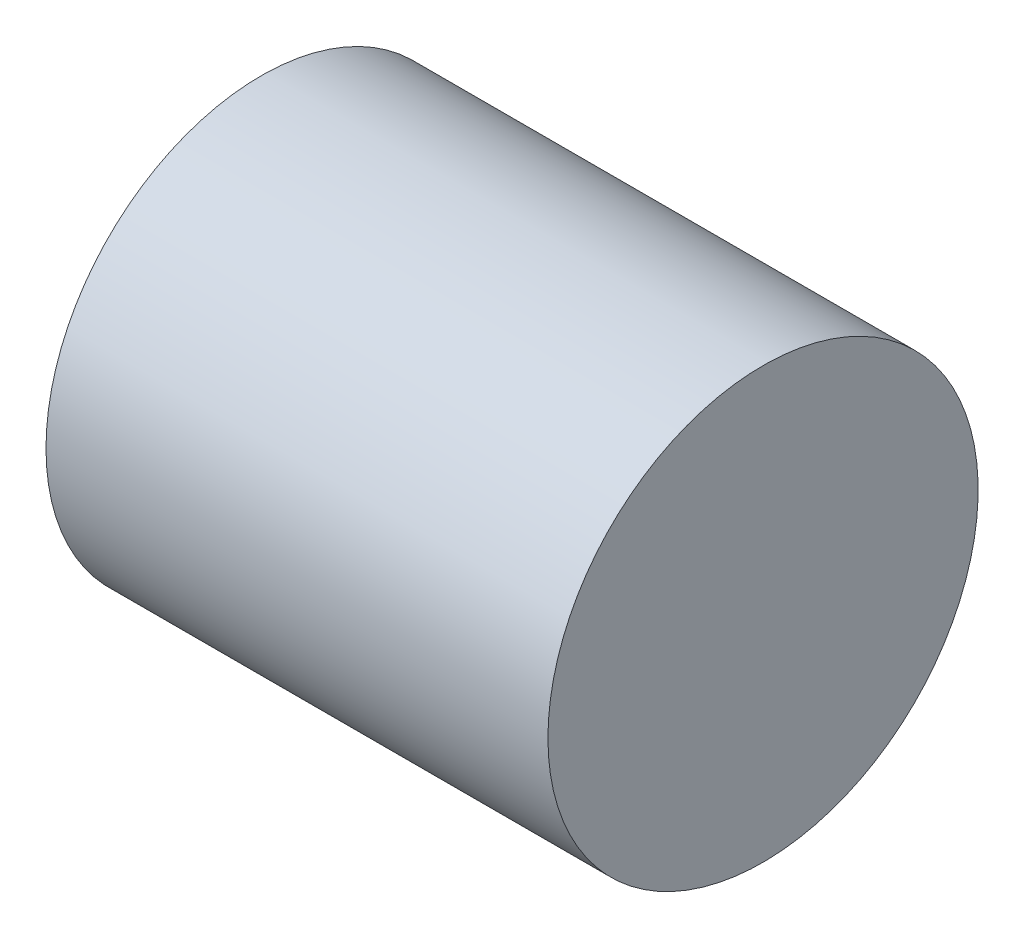
ISO-10303-21;
HEADER;
FILE_DESCRIPTION(('STEP AP214'),'2;1');
FILE_NAME('part.step','',(''),(''),'','','');
FILE_SCHEMA(('AUTOMOTIVE_DESIGN { 1 0 10303 214 1 1 1 1 }'));
ENDSEC;
DATA;
#1=APPLICATION_CONTEXT('core data for automotive mechanical design processes');
#2=APPLICATION_PROTOCOL_DEFINITION('international standard','automotive_design',2000,#1);
#3=PRODUCT_CONTEXT('',#1,'mechanical');
#4=PRODUCT('Part','Part','',(#3));
#5=PRODUCT_RELATED_PRODUCT_CATEGORY('part','',(#4));
#6=PRODUCT_DEFINITION_FORMATION('','',#4);
#7=PRODUCT_DEFINITION_CONTEXT('part definition',#1,'design');
#8=PRODUCT_DEFINITION('design','',#6,#7);
#9=PRODUCT_DEFINITION_SHAPE('','',#8);
#10=(LENGTH_UNIT() NAMED_UNIT(*) SI_UNIT(.MILLI.,.METRE.));
#11=(NAMED_UNIT(*) PLANE_ANGLE_UNIT() SI_UNIT($,.RADIAN.));
#12=(NAMED_UNIT(*) SI_UNIT($,.STERADIAN.) SOLID_ANGLE_UNIT());
#13=UNCERTAINTY_MEASURE_WITH_UNIT(LENGTH_MEASURE(1.E-05),#10,'distance_accuracy_value','');
#14=(GEOMETRIC_REPRESENTATION_CONTEXT(3) GLOBAL_UNCERTAINTY_ASSIGNED_CONTEXT((#13)) GLOBAL_UNIT_ASSIGNED_CONTEXT((#10,
#11,#12)) REPRESENTATION_CONTEXT('',''));
#15=CARTESIAN_POINT('',(0.,0.,0.));
#16=DIRECTION('',(0.,0.,1.));
#17=DIRECTION('',(1.,0.,0.));
#18=AXIS2_PLACEMENT_3D('',#15,#16,#17);
#19=CARTESIAN_POINT('',(44.6,2.8,-5.6));
#20=DIRECTION('',(-1.,0.,0.));
#21=DIRECTION('',(0.,0.,1.));
#22=AXIS2_PLACEMENT_3D('',#19,#20,#21);
#23=PLANE('',#22);
#24=CARTESIAN_POINT('',(44.6,2.8,-5.6));
#25=DIRECTION('',(-1.,0.,0.));
#26=DIRECTION('',(0.,0.,1.));
#27=AXIS2_PLACEMENT_3D('',#24,#25,#26);
#28=CIRCLE('',#27,0.3);
#29=CARTESIAN_POINT('',(44.6,2.8,-5.3));
#30=VERTEX_POINT('',#29);
#31=EDGE_CURVE('E17',#30,#30,#28,.F.);
#32=ORIENTED_EDGE('',*,*,#31,.F.);
#33=EDGE_LOOP('',(#32));
#34=FACE_BOUND('',#33,.T.);
#35=ADVANCED_FACE('F14',(#34),#23,.T.);
#36=CARTESIAN_POINT('',(45.3,2.8,-5.6));
#37=DIRECTION('',(1.,0.,0.));
#38=DIRECTION('',(0.,0.,-1.));
#39=AXIS2_PLACEMENT_3D('',#36,#37,#38);
#40=PLANE('',#39);
#41=CARTESIAN_POINT('',(45.3,2.8,-5.6));
#42=DIRECTION('',(-1.,0.,0.));
#43=DIRECTION('',(0.,0.,1.));
#44=AXIS2_PLACEMENT_3D('',#41,#42,#43);
#45=CIRCLE('',#44,0.3);
#46=CARTESIAN_POINT('',(45.3,2.8,-5.3));
#47=VERTEX_POINT('',#46);
#48=EDGE_CURVE('E10',#47,#47,#45,.T.);
#49=ORIENTED_EDGE('',*,*,#48,.F.);
#50=EDGE_LOOP('',(#49));
#51=FACE_BOUND('',#50,.T.);
#52=ADVANCED_FACE('F29',(#51),#40,.T.);
#53=CARTESIAN_POINT('',(44.95,2.8,-5.6));
#54=DIRECTION('',(-1.,0.,0.));
#55=DIRECTION('',(0.,0.,1.));
#56=AXIS2_PLACEMENT_3D('',#53,#54,#55);
#57=CYLINDRICAL_SURFACE('',#56,0.3);
#58=ORIENTED_EDGE('',*,*,#31,.T.);
#59=EDGE_LOOP('',(#58));
#60=FACE_BOUND('',#59,.T.);
#61=ORIENTED_EDGE('',*,*,#48,.T.);
#62=EDGE_LOOP('',(#61));
#63=FACE_BOUND('',#62,.T.);
#64=ADVANCED_FACE('F26',(#60,#63),#57,.T.);
#65=CLOSED_SHELL('',(#35,#52,#64));
#66=MANIFOLD_SOLID_BREP('B1',#65);
#67=ADVANCED_BREP_SHAPE_REPRESENTATION('',(#18,#66),#14);
#68=SHAPE_DEFINITION_REPRESENTATION(#9,#67);
ENDSEC;
END-ISO-10303-21;
